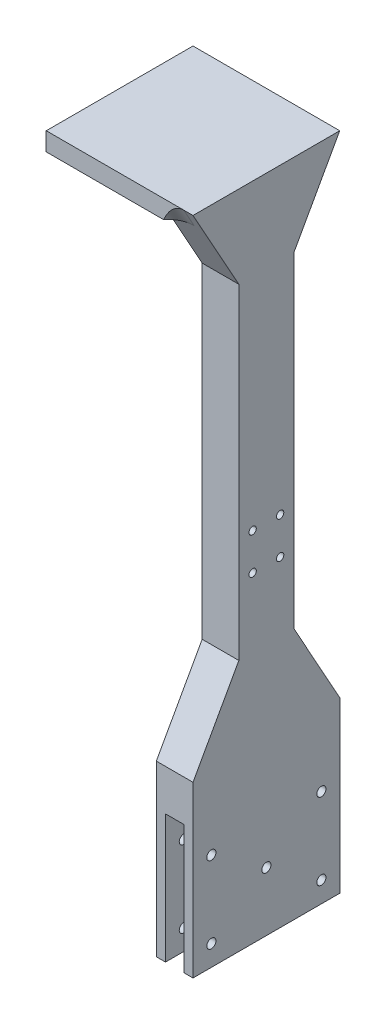
ISO-10303-21;
HEADER;
FILE_DESCRIPTION(('STEP AP214'),'2;1');
FILE_NAME('part.step','',(''),(''),'','','');
FILE_SCHEMA(('AUTOMOTIVE_DESIGN { 1 0 10303 214 1 1 1 1 }'));
ENDSEC;
DATA;
#1=APPLICATION_CONTEXT('core data for automotive mechanical design processes');
#2=APPLICATION_PROTOCOL_DEFINITION('international standard','automotive_design',2000,#1);
#3=PRODUCT_CONTEXT('',#1,'mechanical');
#4=PRODUCT('Part','Part','',(#3));
#5=PRODUCT_RELATED_PRODUCT_CATEGORY('part','',(#4));
#6=PRODUCT_DEFINITION_FORMATION('','',#4);
#7=PRODUCT_DEFINITION_CONTEXT('part definition',#1,'design');
#8=PRODUCT_DEFINITION('design','',#6,#7);
#9=PRODUCT_DEFINITION_SHAPE('','',#8);
#10=(LENGTH_UNIT() NAMED_UNIT(*) SI_UNIT(.MILLI.,.METRE.));
#11=(NAMED_UNIT(*) PLANE_ANGLE_UNIT() SI_UNIT($,.RADIAN.));
#12=(NAMED_UNIT(*) SI_UNIT($,.STERADIAN.) SOLID_ANGLE_UNIT());
#13=UNCERTAINTY_MEASURE_WITH_UNIT(LENGTH_MEASURE(1.E-05),#10,'distance_accuracy_value','');
#14=(GEOMETRIC_REPRESENTATION_CONTEXT(3) GLOBAL_UNCERTAINTY_ASSIGNED_CONTEXT((#13)) GLOBAL_UNIT_ASSIGNED_CONTEXT((#10,
#11,#12)) REPRESENTATION_CONTEXT('',''));
#15=CARTESIAN_POINT('',(0.,0.,0.));
#16=DIRECTION('',(0.,0.,1.));
#17=DIRECTION('',(1.,0.,0.));
#18=AXIS2_PLACEMENT_3D('',#15,#16,#17);
#19=CARTESIAN_POINT('',(0.,0.,80.));
#20=DIRECTION('',(1.,0.,0.));
#21=DIRECTION('',(0.,0.,-1.));
#22=AXIS2_PLACEMENT_3D('',#19,#20,#21);
#23=PLANE('',#22);
#24=CARTESIAN_POINT('',(0.,195.,32.5));
#25=DIRECTION('',(1.,0.,0.));
#26=DIRECTION('',(0.,0.,-1.));
#27=AXIS2_PLACEMENT_3D('',#24,#25,#26);
#28=CIRCLE('',#27,2.);
#29=CARTESIAN_POINT('',(0.,195.,30.5));
#30=VERTEX_POINT('',#29);
#31=EDGE_CURVE('E315',#30,#30,#28,.F.);
#32=ORIENTED_EDGE('',*,*,#31,.F.);
#33=EDGE_LOOP('',(#32));
#34=FACE_BOUND('',#33,.T.);
#35=CARTESIAN_POINT('',(0.,175.,32.5));
#36=DIRECTION('',(1.,0.,0.));
#37=DIRECTION('',(0.,0.,-1.));
#38=AXIS2_PLACEMENT_3D('',#35,#36,#37);
#39=CIRCLE('',#38,2.);
#40=CARTESIAN_POINT('',(0.,175.,30.5));
#41=VERTEX_POINT('',#40);
#42=EDGE_CURVE('E323',#41,#41,#39,.F.);
#43=ORIENTED_EDGE('',*,*,#42,.F.);
#44=EDGE_LOOP('',(#43));
#45=FACE_BOUND('',#44,.T.);
#46=CARTESIAN_POINT('',(0.,175.,47.5));
#47=DIRECTION('',(1.,0.,0.));
#48=DIRECTION('',(0.,0.,-1.));
#49=AXIS2_PLACEMENT_3D('',#46,#47,#48);
#50=CIRCLE('',#49,2.);
#51=CARTESIAN_POINT('',(0.,175.,45.5));
#52=VERTEX_POINT('',#51);
#53=EDGE_CURVE('E316',#52,#52,#50,.F.);
#54=ORIENTED_EDGE('',*,*,#53,.F.);
#55=EDGE_LOOP('',(#54));
#56=FACE_BOUND('',#55,.T.);
#57=CARTESIAN_POINT('',(0.,195.,47.5));
#58=DIRECTION('',(1.,0.,0.));
#59=DIRECTION('',(0.,0.,-1.));
#60=AXIS2_PLACEMENT_3D('',#57,#58,#59);
#61=CIRCLE('',#60,2.);
#62=CARTESIAN_POINT('',(0.,195.,45.5));
#63=VERTEX_POINT('',#62);
#64=EDGE_CURVE('E303',#63,#63,#61,.F.);
#65=ORIENTED_EDGE('',*,*,#64,.F.);
#66=EDGE_LOOP('',(#65));
#67=FACE_BOUND('',#66,.T.);
#68=CARTESIAN_POINT('',(0.,53.0571843789609,70.));
#69=DIRECTION('',(1.,0.,0.));
#70=DIRECTION('',(0.,0.,-1.));
#71=AXIS2_PLACEMENT_3D('',#68,#69,#70);
#72=CIRCLE('',#71,2.5);
#73=CARTESIAN_POINT('',(0.,53.0571843789609,67.5));
#74=VERTEX_POINT('',#73);
#75=EDGE_CURVE('E136',#74,#74,#72,.F.);
#76=ORIENTED_EDGE('',*,*,#75,.F.);
#77=EDGE_LOOP('',(#76));
#78=FACE_BOUND('',#77,.T.);
#79=CARTESIAN_POINT('',(0.,53.0571843789609,10.));
#80=DIRECTION('',(1.,0.,0.));
#81=DIRECTION('',(0.,0.,-1.));
#82=AXIS2_PLACEMENT_3D('',#79,#80,#81);
#83=CIRCLE('',#82,2.5);
#84=CARTESIAN_POINT('',(0.,53.0571843789609,7.5));
#85=VERTEX_POINT('',#84);
#86=EDGE_CURVE('E245',#85,#85,#83,.F.);
#87=ORIENTED_EDGE('',*,*,#86,.F.);
#88=EDGE_LOOP('',(#87));
#89=FACE_BOUND('',#88,.T.);
#90=CARTESIAN_POINT('',(0.,11.2845520257299,10.));
#91=DIRECTION('',(1.,0.,0.));
#92=DIRECTION('',(0.,0.,-1.));
#93=AXIS2_PLACEMENT_3D('',#90,#91,#92);
#94=CIRCLE('',#93,2.5);
#95=CARTESIAN_POINT('',(0.,11.2845520257299,7.5));
#96=VERTEX_POINT('',#95);
#97=EDGE_CURVE('E239',#96,#96,#94,.F.);
#98=ORIENTED_EDGE('',*,*,#97,.F.);
#99=EDGE_LOOP('',(#98));
#100=FACE_BOUND('',#99,.T.);
#101=CARTESIAN_POINT('',(0.,32.1708682023454,40.));
#102=DIRECTION('',(1.,0.,0.));
#103=DIRECTION('',(0.,0.,-1.));
#104=AXIS2_PLACEMENT_3D('',#101,#102,#103);
#105=CIRCLE('',#104,2.5);
#106=CARTESIAN_POINT('',(0.,32.1708682023454,37.5));
#107=VERTEX_POINT('',#106);
#108=EDGE_CURVE('E231',#107,#107,#105,.F.);
#109=ORIENTED_EDGE('',*,*,#108,.F.);
#110=EDGE_LOOP('',(#109));
#111=FACE_BOUND('',#110,.T.);
#112=CARTESIAN_POINT('',(0.,11.2845520257299,70.));
#113=DIRECTION('',(1.,0.,0.));
#114=DIRECTION('',(0.,0.,-1.));
#115=AXIS2_PLACEMENT_3D('',#112,#113,#114);
#116=CIRCLE('',#115,2.5);
#117=CARTESIAN_POINT('',(0.,11.2845520257299,67.5));
#118=VERTEX_POINT('',#117);
#119=EDGE_CURVE('E141',#118,#118,#116,.F.);
#120=ORIENTED_EDGE('',*,*,#119,.F.);
#121=EDGE_LOOP('',(#120));
#122=FACE_BOUND('',#121,.T.);
#123=DIRECTION('',(0.,-0.874157276121537,-0.485642931178633));
#124=VECTOR('',#123,1.);
#125=CARTESIAN_POINT('',(0.,21.7938888742245,-39.2289999736039));
#126=LINE('',#125,#124);
#127=CARTESIAN_POINT('',(0.,137.406088826711,25.));
#128=VERTEX_POINT('',#127);
#129=CARTESIAN_POINT('',(0.,92.4060888267112,0.));
#130=VERTEX_POINT('',#129);
#131=EDGE_CURVE('E280',#128,#130,#126,.T.);
#132=ORIENTED_EDGE('',*,*,#131,.T.);
#133=DIRECTION('',(0.,-1.,0.));
#134=VECTOR('',#133,1.);
#135=CARTESIAN_POINT('',(0.,0.,0.));
#136=LINE('',#135,#134);
#137=CARTESIAN_POINT('',(0.,0.,0.));
#138=VERTEX_POINT('',#137);
#139=EDGE_CURVE('E158',#130,#138,#136,.T.);
#140=ORIENTED_EDGE('',*,*,#139,.T.);
#141=DIRECTION('',(0.,0.,-1.));
#142=VECTOR('',#141,1.);
#143=CARTESIAN_POINT('',(0.,0.,80.));
#144=LINE('',#143,#142);
#145=CARTESIAN_POINT('',(0.,0.,80.));
#146=VERTEX_POINT('',#145);
#147=EDGE_CURVE('E119',#146,#138,#144,.T.);
#148=ORIENTED_EDGE('',*,*,#147,.F.);
#149=DIRECTION('',(0.,-1.,0.));
#150=VECTOR('',#149,1.);
#151=CARTESIAN_POINT('',(0.,0.,80.));
#152=LINE('',#151,#150);
#153=CARTESIAN_POINT('',(0.,92.4060888267109,80.));
#154=VERTEX_POINT('',#153);
#155=EDGE_CURVE('E153',#154,#146,#152,.T.);
#156=ORIENTED_EDGE('',*,*,#155,.F.);
#157=DIRECTION('',(0.,-0.874157276121537,0.485642931178633));
#158=VECTOR('',#157,1.);
#159=CARTESIAN_POINT('',(0.,55.7561530251678,100.361075445302));
#160=LINE('',#159,#158);
#161=CARTESIAN_POINT('',(0.,137.406088826711,55.));
#162=VERTEX_POINT('',#161);
#163=EDGE_CURVE('E258',#162,#154,#160,.T.);
#164=ORIENTED_EDGE('',*,*,#163,.F.);
#165=DIRECTION('',(0.,1.,0.));
#166=VECTOR('',#165,1.);
#167=CARTESIAN_POINT('',(0.,0.,55.));
#168=LINE('',#167,#166);
#169=CARTESIAN_POINT('',(0.,315.,55.));
#170=VERTEX_POINT('',#169);
#171=EDGE_CURVE('E238',#162,#170,#168,.T.);
#172=ORIENTED_EDGE('',*,*,#171,.T.);
#173=DIRECTION('',(0.,0.874157276121538,0.485642931178632));
#174=VECTOR('',#173,1.);
#175=CARTESIAN_POINT('',(0.,50.9433962264152,-91.6981132075472));
#176=LINE('',#175,#174);
#177=CARTESIAN_POINT('',(0.,350.,74.4444444444444));
#178=VERTEX_POINT('',#177);
#179=EDGE_CURVE('E255',#170,#178,#176,.T.);
#180=ORIENTED_EDGE('',*,*,#179,.T.);
#181=DIRECTION('',(0.,0.,-1.));
#182=VECTOR('',#181,1.);
#183=CARTESIAN_POINT('',(0.,350.,80.));
#184=LINE('',#183,#182);
#185=CARTESIAN_POINT('',(0.,350.,5.55555555555556));
#186=VERTEX_POINT('',#185);
#187=EDGE_CURVE('E147',#178,#186,#184,.T.);
#188=ORIENTED_EDGE('',*,*,#187,.T.);
#189=DIRECTION('',(0.,0.874157276121537,-0.485642931178633));
#190=VECTOR('',#189,1.);
#191=CARTESIAN_POINT('',(0.,84.9056603773587,152.830188679245));
#192=LINE('',#191,#190);
#193=CARTESIAN_POINT('',(0.,315.,25.));
#194=VERTEX_POINT('',#193);
#195=EDGE_CURVE('E114',#194,#186,#192,.T.);
#196=ORIENTED_EDGE('',*,*,#195,.F.);
#197=DIRECTION('',(0.,1.,0.));
#198=VECTOR('',#197,1.);
#199=CARTESIAN_POINT('',(0.,0.,25.));
#200=LINE('',#199,#198);
#201=EDGE_CURVE('E306',#128,#194,#200,.T.);
#202=ORIENTED_EDGE('',*,*,#201,.F.);
#203=EDGE_LOOP('',(#132,#140,#148,#156,#164,#172,#180,#188,#196,#202));
#204=FACE_BOUND('',#203,.T.);
#205=ADVANCED_FACE('F33',(#34,#45,#56,#67,#78,#89,#100,#111,#122,#204),#23,.F.);
#206=CARTESIAN_POINT('',(20.,0.,80.));
#207=DIRECTION('',(-1.,0.,0.));
#208=DIRECTION('',(0.,0.,1.));
#209=AXIS2_PLACEMENT_3D('',#206,#207,#208);
#210=PLANE('',#209);
#211=CARTESIAN_POINT('',(20.,195.,32.5));
#212=DIRECTION('',(1.,0.,0.));
#213=DIRECTION('',(0.,0.,1.));
#214=AXIS2_PLACEMENT_3D('',#211,#212,#213);
#215=CIRCLE('',#214,2.);
#216=CARTESIAN_POINT('',(20.,195.,34.5));
#217=VERTEX_POINT('',#216);
#218=EDGE_CURVE('E326',#217,#217,#215,.T.);
#219=ORIENTED_EDGE('',*,*,#218,.F.);
#220=EDGE_LOOP('',(#219));
#221=FACE_BOUND('',#220,.T.);
#222=CARTESIAN_POINT('',(20.,175.,32.5));
#223=DIRECTION('',(1.,0.,0.));
#224=DIRECTION('',(0.,0.,-1.));
#225=AXIS2_PLACEMENT_3D('',#222,#223,#224);
#226=CIRCLE('',#225,2.);
#227=CARTESIAN_POINT('',(20.,175.,30.5));
#228=VERTEX_POINT('',#227);
#229=EDGE_CURVE('E319',#228,#228,#226,.T.);
#230=ORIENTED_EDGE('',*,*,#229,.F.);
#231=EDGE_LOOP('',(#230));
#232=FACE_BOUND('',#231,.T.);
#233=CARTESIAN_POINT('',(20.,175.,47.5));
#234=DIRECTION('',(1.,0.,0.));
#235=DIRECTION('',(0.,0.,1.));
#236=AXIS2_PLACEMENT_3D('',#233,#234,#235);
#237=CIRCLE('',#236,2.);
#238=CARTESIAN_POINT('',(20.,175.,49.5));
#239=VERTEX_POINT('',#238);
#240=EDGE_CURVE('E320',#239,#239,#237,.T.);
#241=ORIENTED_EDGE('',*,*,#240,.F.);
#242=EDGE_LOOP('',(#241));
#243=FACE_BOUND('',#242,.T.);
#244=CARTESIAN_POINT('',(20.,195.,47.5));
#245=DIRECTION('',(1.,0.,0.));
#246=DIRECTION('',(0.,0.,-1.));
#247=AXIS2_PLACEMENT_3D('',#244,#245,#246);
#248=CIRCLE('',#247,2.);
#249=CARTESIAN_POINT('',(20.,195.,45.5));
#250=VERTEX_POINT('',#249);
#251=EDGE_CURVE('E312',#250,#250,#248,.T.);
#252=ORIENTED_EDGE('',*,*,#251,.F.);
#253=EDGE_LOOP('',(#252));
#254=FACE_BOUND('',#253,.T.);
#255=CARTESIAN_POINT('',(20.0000000000001,53.0571843789609,70.));
#256=DIRECTION('',(1.,0.,0.));
#257=DIRECTION('',(0.,1.,0.));
#258=AXIS2_PLACEMENT_3D('',#255,#256,#257);
#259=CIRCLE('',#258,2.5);
#260=CARTESIAN_POINT('',(20.0000000000001,55.5571843789609,70.));
#261=VERTEX_POINT('',#260);
#262=EDGE_CURVE('E248',#261,#261,#259,.T.);
#263=ORIENTED_EDGE('',*,*,#262,.F.);
#264=EDGE_LOOP('',(#263));
#265=FACE_BOUND('',#264,.T.);
#266=CARTESIAN_POINT('',(20.0000000000001,53.0571843789609,10.));
#267=DIRECTION('',(1.,0.,0.));
#268=DIRECTION('',(0.,1.,0.));
#269=AXIS2_PLACEMENT_3D('',#266,#267,#268);
#270=CIRCLE('',#269,2.5);
#271=CARTESIAN_POINT('',(20.0000000000001,55.5571843789609,10.));
#272=VERTEX_POINT('',#271);
#273=EDGE_CURVE('E242',#272,#272,#270,.T.);
#274=ORIENTED_EDGE('',*,*,#273,.F.);
#275=EDGE_LOOP('',(#274));
#276=FACE_BOUND('',#275,.T.);
#277=CARTESIAN_POINT('',(20.0000000000001,11.2845520257299,10.));
#278=DIRECTION('',(1.,0.,0.));
#279=DIRECTION('',(0.,1.,0.));
#280=AXIS2_PLACEMENT_3D('',#277,#278,#279);
#281=CIRCLE('',#280,2.5);
#282=CARTESIAN_POINT('',(20.0000000000001,13.7845520257299,10.));
#283=VERTEX_POINT('',#282);
#284=EDGE_CURVE('E234',#283,#283,#281,.T.);
#285=ORIENTED_EDGE('',*,*,#284,.F.);
#286=EDGE_LOOP('',(#285));
#287=FACE_BOUND('',#286,.T.);
#288=CARTESIAN_POINT('',(20.0000000000001,32.1708682023454,40.));
#289=DIRECTION('',(1.,0.,0.));
#290=DIRECTION('',(0.,1.,0.));
#291=AXIS2_PLACEMENT_3D('',#288,#289,#290);
#292=CIRCLE('',#291,2.5);
#293=CARTESIAN_POINT('',(20.0000000000001,34.6708682023454,40.));
#294=VERTEX_POINT('',#293);
#295=EDGE_CURVE('E235',#294,#294,#292,.T.);
#296=ORIENTED_EDGE('',*,*,#295,.F.);
#297=EDGE_LOOP('',(#296));
#298=FACE_BOUND('',#297,.T.);
#299=CARTESIAN_POINT('',(20.0000000000001,11.2845520257299,70.));
#300=DIRECTION('',(1.,0.,0.));
#301=DIRECTION('',(0.,1.,0.));
#302=AXIS2_PLACEMENT_3D('',#299,#300,#301);
#303=CIRCLE('',#302,2.5);
#304=CARTESIAN_POINT('',(20.0000000000001,13.7845520257299,70.));
#305=VERTEX_POINT('',#304);
#306=EDGE_CURVE('E220',#305,#305,#303,.T.);
#307=ORIENTED_EDGE('',*,*,#306,.F.);
#308=EDGE_LOOP('',(#307));
#309=FACE_BOUND('',#308,.T.);
#310=DIRECTION('',(0.,0.874157276121537,0.485642931178634));
#311=VECTOR('',#310,1.);
#312=CARTESIAN_POINT('',(20.,21.7938888742245,-39.2289999736039));
#313=LINE('',#312,#311);
#314=CARTESIAN_POINT('',(20.,92.4060888267112,0.));
#315=VERTEX_POINT('',#314);
#316=CARTESIAN_POINT('',(20.,137.406088826711,25.));
#317=VERTEX_POINT('',#316);
#318=EDGE_CURVE('E300',#315,#317,#313,.T.);
#319=ORIENTED_EDGE('',*,*,#318,.T.);
#320=DIRECTION('',(0.,-1.,0.));
#321=VECTOR('',#320,1.);
#322=CARTESIAN_POINT('',(20.,0.,25.));
#323=LINE('',#322,#321);
#324=CARTESIAN_POINT('',(20.,315.,25.));
#325=VERTEX_POINT('',#324);
#326=EDGE_CURVE('E289',#325,#317,#323,.T.);
#327=ORIENTED_EDGE('',*,*,#326,.F.);
#328=DIRECTION('',(0.,-0.874157276121537,0.485642931178633));
#329=VECTOR('',#328,1.);
#330=CARTESIAN_POINT('',(20.,84.9056603773587,152.830188679245));
#331=LINE('',#330,#329);
#332=CARTESIAN_POINT('',(20.,360.,0.));
#333=VERTEX_POINT('',#332);
#334=EDGE_CURVE('E297',#333,#325,#331,.T.);
#335=ORIENTED_EDGE('',*,*,#334,.F.);
#336=DIRECTION('',(0.,0.,-1.));
#337=VECTOR('',#336,1.);
#338=CARTESIAN_POINT('',(20.,360.,0.));
#339=LINE('',#338,#337);
#340=CARTESIAN_POINT('',(20.,360.,80.));
#341=VERTEX_POINT('',#340);
#342=EDGE_CURVE('E172',#341,#333,#339,.T.);
#343=ORIENTED_EDGE('',*,*,#342,.F.);
#344=DIRECTION('',(0.,-0.874157276121538,-0.485642931178632));
#345=VECTOR('',#344,1.);
#346=CARTESIAN_POINT('',(20.,50.9433962264152,-91.6981132075472));
#347=LINE('',#346,#345);
#348=CARTESIAN_POINT('',(20.,315.,55.));
#349=VERTEX_POINT('',#348);
#350=EDGE_CURVE('E274',#341,#349,#347,.T.);
#351=ORIENTED_EDGE('',*,*,#350,.T.);
#352=DIRECTION('',(0.,-1.,0.));
#353=VECTOR('',#352,1.);
#354=CARTESIAN_POINT('',(20.,0.,55.));
#355=LINE('',#354,#353);
#356=CARTESIAN_POINT('',(20.,137.406088826711,55.));
#357=VERTEX_POINT('',#356);
#358=EDGE_CURVE('E277',#349,#357,#355,.T.);
#359=ORIENTED_EDGE('',*,*,#358,.T.);
#360=DIRECTION('',(0.,0.874157276121538,-0.485642931178633));
#361=VECTOR('',#360,1.);
#362=CARTESIAN_POINT('',(20.,55.7561530251678,100.361075445302));
#363=LINE('',#362,#361);
#364=CARTESIAN_POINT('',(20.,92.4060888267109,80.));
#365=VERTEX_POINT('',#364);
#366=EDGE_CURVE('E264',#365,#357,#363,.T.);
#367=ORIENTED_EDGE('',*,*,#366,.F.);
#368=DIRECTION('',(0.,1.,0.));
#369=VECTOR('',#368,1.);
#370=CARTESIAN_POINT('',(20.,0.,80.));
#371=LINE('',#370,#369);
#372=CARTESIAN_POINT('',(20.,0.,80.));
#373=VERTEX_POINT('',#372);
#374=EDGE_CURVE('E149',#373,#365,#371,.T.);
#375=ORIENTED_EDGE('',*,*,#374,.F.);
#376=DIRECTION('',(0.,0.,-1.));
#377=VECTOR('',#376,1.);
#378=CARTESIAN_POINT('',(20.,0.,80.));
#379=LINE('',#378,#377);
#380=CARTESIAN_POINT('',(20.,0.,0.));
#381=VERTEX_POINT('',#380);
#382=EDGE_CURVE('E144',#373,#381,#379,.T.);
#383=ORIENTED_EDGE('',*,*,#382,.T.);
#384=DIRECTION('',(0.,1.,0.));
#385=VECTOR('',#384,1.);
#386=CARTESIAN_POINT('',(20.,0.,0.));
#387=LINE('',#386,#385);
#388=EDGE_CURVE('E150',#381,#315,#387,.T.);
#389=ORIENTED_EDGE('',*,*,#388,.T.);
#390=EDGE_LOOP('',(#319,#327,#335,#343,#351,#359,#367,#375,#383,#389));
#391=FACE_BOUND('',#390,.T.);
#392=ADVANCED_FACE('F336',(#221,#232,#243,#254,#265,#276,#287,#298,#309,#391),#210,.F.);
#393=CARTESIAN_POINT('',(0.,0.,0.));
#394=DIRECTION('',(0.,0.,-1.));
#395=DIRECTION('',(-1.,0.,0.));
#396=AXIS2_PLACEMENT_3D('',#393,#394,#395);
#397=PLANE('',#396);
#398=ORIENTED_EDGE('',*,*,#139,.F.);
#399=DIRECTION('',(1.,0.,0.));
#400=VECTOR('',#399,1.);
#401=CARTESIAN_POINT('',(-268.759188302499,92.4060888267112,0.));
#402=LINE('',#401,#400);
#403=EDGE_CURVE('E285',#130,#315,#402,.T.);
#404=ORIENTED_EDGE('',*,*,#403,.T.);
#405=ORIENTED_EDGE('',*,*,#388,.F.);
#406=DIRECTION('',(1.,0.,0.));
#407=VECTOR('',#406,1.);
#408=CARTESIAN_POINT('',(0.,0.,0.));
#409=LINE('',#408,#407);
#410=CARTESIAN_POINT('',(15.,0.,0.));
#411=VERTEX_POINT('',#410);
#412=EDGE_CURVE('E157',#411,#381,#409,.T.);
#413=ORIENTED_EDGE('',*,*,#412,.F.);
#414=DIRECTION('',(0.,1.,0.));
#415=VECTOR('',#414,1.);
#416=CARTESIAN_POINT('',(15.,70.,0.));
#417=LINE('',#416,#415);
#418=CARTESIAN_POINT('',(15.,70.,0.));
#419=VERTEX_POINT('',#418);
#420=EDGE_CURVE('E193',#411,#419,#417,.T.);
#421=ORIENTED_EDGE('',*,*,#420,.T.);
#422=DIRECTION('',(-1.,0.,0.));
#423=VECTOR('',#422,1.);
#424=CARTESIAN_POINT('',(4.99999999999998,70.,0.));
#425=LINE('',#424,#423);
#426=CARTESIAN_POINT('',(4.99999999999998,70.,0.));
#427=VERTEX_POINT('',#426);
#428=EDGE_CURVE('E198',#419,#427,#425,.T.);
#429=ORIENTED_EDGE('',*,*,#428,.T.);
#430=DIRECTION('',(0.,-1.,0.));
#431=VECTOR('',#430,1.);
#432=CARTESIAN_POINT('',(4.99999999999998,70.,0.));
#433=LINE('',#432,#431);
#434=CARTESIAN_POINT('',(5.,0.,0.));
#435=VERTEX_POINT('',#434);
#436=EDGE_CURVE('E189',#427,#435,#433,.T.);
#437=ORIENTED_EDGE('',*,*,#436,.T.);
#438=EDGE_CURVE('E154',#138,#435,#409,.T.);
#439=ORIENTED_EDGE('',*,*,#438,.F.);
#440=EDGE_LOOP('',(#398,#404,#405,#413,#421,#429,#437,#439));
#441=FACE_BOUND('',#440,.T.);
#442=ADVANCED_FACE('F339',(#441),#397,.T.);
#443=DIRECTION('',(-1.,0.,0.));
#444=VECTOR('',#443,1.);
#445=CARTESIAN_POINT('',(-60.,360.,0.));
#446=LINE('',#445,#444);
#447=CARTESIAN_POINT('',(15.,360.,0.));
#448=VERTEX_POINT('',#447);
#449=CARTESIAN_POINT('',(-60.,360.,0.));
#450=VERTEX_POINT('',#449);
#451=EDGE_CURVE('E75',#448,#450,#446,.T.);
#452=ORIENTED_EDGE('',*,*,#451,.F.);
#453=CARTESIAN_POINT('',(15.,329.113109577039,0.));
#454=DIRECTION('',(0.,0.,-1.));
#455=DIRECTION('',(0.,1.,0.));
#456=AXIS2_PLACEMENT_3D('',#453,#454,#455);
#457=ELLIPSE('',#456,30.8868904229609,15.);
#458=CARTESIAN_POINT('',(3.94975232434984,350.,0.));
#459=VERTEX_POINT('',#458);
#460=EDGE_CURVE('E42',#448,#459,#457,.F.);
#461=ORIENTED_EDGE('',*,*,#460,.T.);
#462=DIRECTION('',(-1.,0.,0.));
#463=VECTOR('',#462,1.);
#464=CARTESIAN_POINT('',(-60.,350.,0.));
#465=LINE('',#464,#463);
#466=CARTESIAN_POINT('',(-60.,350.,0.));
#467=VERTEX_POINT('',#466);
#468=EDGE_CURVE('E104',#459,#467,#465,.T.);
#469=ORIENTED_EDGE('',*,*,#468,.T.);
#470=DIRECTION('',(0.,-1.,0.));
#471=VECTOR('',#470,1.);
#472=CARTESIAN_POINT('',(-60.,360.,0.));
#473=LINE('',#472,#471);
#474=EDGE_CURVE('E161',#450,#467,#473,.T.);
#475=ORIENTED_EDGE('',*,*,#474,.F.);
#476=EDGE_LOOP('',(#452,#461,#469,#475));
#477=FACE_BOUND('',#476,.T.);
#478=ADVANCED_FACE('F101',(#477),#397,.T.);
#479=CARTESIAN_POINT('',(0.,0.,80.));
#480=DIRECTION('',(0.,0.,-1.));
#481=DIRECTION('',(-1.,0.,0.));
#482=AXIS2_PLACEMENT_3D('',#479,#480,#481);
#483=PLANE('',#482);
#484=DIRECTION('',(1.,0.,0.));
#485=VECTOR('',#484,1.);
#486=CARTESIAN_POINT('',(20.,350.,80.));
#487=LINE('',#486,#485);
#488=CARTESIAN_POINT('',(-60.,350.,80.));
#489=VERTEX_POINT('',#488);
#490=CARTESIAN_POINT('',(3.94975232434976,350.,80.));
#491=VERTEX_POINT('',#490);
#492=EDGE_CURVE('E64',#489,#491,#487,.T.);
#493=ORIENTED_EDGE('',*,*,#492,.T.);
#494=CARTESIAN_POINT('',(15.,329.113109577039,80.));
#495=DIRECTION('',(0.,0.,-1.));
#496=DIRECTION('',(0.,-1.,0.));
#497=AXIS2_PLACEMENT_3D('',#494,#495,#496);
#498=ELLIPSE('',#497,30.886890422961,15.);
#499=CARTESIAN_POINT('',(15.,360.,80.));
#500=VERTEX_POINT('',#499);
#501=EDGE_CURVE('E69',#491,#500,#498,.T.);
#502=ORIENTED_EDGE('',*,*,#501,.T.);
#503=DIRECTION('',(1.,0.,0.));
#504=VECTOR('',#503,1.);
#505=CARTESIAN_POINT('',(20.,360.,80.));
#506=LINE('',#505,#504);
#507=CARTESIAN_POINT('',(-60.,360.,80.));
#508=VERTEX_POINT('',#507);
#509=EDGE_CURVE('E180',#508,#500,#506,.T.);
#510=ORIENTED_EDGE('',*,*,#509,.F.);
#511=DIRECTION('',(0.,-1.,0.));
#512=VECTOR('',#511,1.);
#513=CARTESIAN_POINT('',(-60.,360.,80.));
#514=LINE('',#513,#512);
#515=EDGE_CURVE('E73',#508,#489,#514,.T.);
#516=ORIENTED_EDGE('',*,*,#515,.T.);
#517=EDGE_LOOP('',(#493,#502,#510,#516));
#518=FACE_BOUND('',#517,.T.);
#519=ADVANCED_FACE('F66',(#518),#483,.F.);
#520=CARTESIAN_POINT('',(0.,0.,80.));
#521=DIRECTION('',(0.,1.,0.));
#522=DIRECTION('',(0.,0.,1.));
#523=AXIS2_PLACEMENT_3D('',#520,#521,#522);
#524=PLANE('',#523);
#525=DIRECTION('',(1.,0.,0.));
#526=VECTOR('',#525,1.);
#527=CARTESIAN_POINT('',(0.,0.,80.));
#528=LINE('',#527,#526);
#529=CARTESIAN_POINT('',(15.,0.,80.));
#530=VERTEX_POINT('',#529);
#531=EDGE_CURVE('E167',#530,#373,#528,.T.);
#532=ORIENTED_EDGE('',*,*,#531,.F.);
#533=DIRECTION('',(0.,0.,1.));
#534=VECTOR('',#533,1.);
#535=CARTESIAN_POINT('',(15.,0.,-70.7106781186548));
#536=LINE('',#535,#534);
#537=EDGE_CURVE('E190',#411,#530,#536,.T.);
#538=ORIENTED_EDGE('',*,*,#537,.F.);
#539=ORIENTED_EDGE('',*,*,#412,.T.);
#540=ORIENTED_EDGE('',*,*,#382,.F.);
#541=EDGE_LOOP('',(#532,#538,#539,#540));
#542=FACE_BOUND('',#541,.T.);
#543=ADVANCED_FACE('F589',(#542),#524,.F.);
#544=ORIENTED_EDGE('',*,*,#438,.T.);
#545=DIRECTION('',(0.,0.,1.));
#546=VECTOR('',#545,1.);
#547=CARTESIAN_POINT('',(5.00000000000001,0.,-70.7106781186548));
#548=LINE('',#547,#546);
#549=CARTESIAN_POINT('',(5.00000000000001,0.,80.));
#550=VERTEX_POINT('',#549);
#551=EDGE_CURVE('E177',#435,#550,#548,.T.);
#552=ORIENTED_EDGE('',*,*,#551,.T.);
#553=EDGE_CURVE('E164',#146,#550,#528,.T.);
#554=ORIENTED_EDGE('',*,*,#553,.F.);
#555=ORIENTED_EDGE('',*,*,#147,.T.);
#556=EDGE_LOOP('',(#544,#552,#554,#555));
#557=FACE_BOUND('',#556,.T.);
#558=ADVANCED_FACE('F488',(#557),#524,.F.);
#559=ORIENTED_EDGE('',*,*,#374,.T.);
#560=DIRECTION('',(1.,0.,0.));
#561=VECTOR('',#560,1.);
#562=CARTESIAN_POINT('',(-268.759188302499,92.4060888267109,80.));
#563=LINE('',#562,#561);
#564=EDGE_CURVE('E267',#154,#365,#563,.T.);
#565=ORIENTED_EDGE('',*,*,#564,.F.);
#566=ORIENTED_EDGE('',*,*,#155,.T.);
#567=ORIENTED_EDGE('',*,*,#553,.T.);
#568=DIRECTION('',(0.,-1.,0.));
#569=VECTOR('',#568,1.);
#570=CARTESIAN_POINT('',(4.99999999999998,70.,80.));
#571=LINE('',#570,#569);
#572=CARTESIAN_POINT('',(4.99999999999998,70.,80.));
#573=VERTEX_POINT('',#572);
#574=EDGE_CURVE('E208',#573,#550,#571,.T.);
#575=ORIENTED_EDGE('',*,*,#574,.F.);
#576=DIRECTION('',(-1.,0.,0.));
#577=VECTOR('',#576,1.);
#578=CARTESIAN_POINT('',(4.99999999999998,70.,80.));
#579=LINE('',#578,#577);
#580=CARTESIAN_POINT('',(15.,70.,80.));
#581=VERTEX_POINT('',#580);
#582=EDGE_CURVE('E194',#581,#573,#579,.T.);
#583=ORIENTED_EDGE('',*,*,#582,.F.);
#584=DIRECTION('',(0.,1.,0.));
#585=VECTOR('',#584,1.);
#586=CARTESIAN_POINT('',(15.,70.,80.));
#587=LINE('',#586,#585);
#588=EDGE_CURVE('E211',#530,#581,#587,.T.);
#589=ORIENTED_EDGE('',*,*,#588,.F.);
#590=ORIENTED_EDGE('',*,*,#531,.T.);
#591=EDGE_LOOP('',(#559,#565,#566,#567,#575,#583,#589,#590));
#592=FACE_BOUND('',#591,.T.);
#593=ADVANCED_FACE('F467',(#592),#483,.F.);
#594=CARTESIAN_POINT('',(0.,350.,0.));
#595=DIRECTION('',(0.,-1.,0.));
#596=DIRECTION('',(0.,0.,-1.));
#597=AXIS2_PLACEMENT_3D('',#594,#595,#596);
#598=PLANE('',#597);
#599=ORIENTED_EDGE('',*,*,#187,.F.);
#600=DIRECTION('',(-1.,0.,0.));
#601=VECTOR('',#600,1.);
#602=CARTESIAN_POINT('',(0.,350.,74.4444444444444));
#603=LINE('',#602,#601);
#604=CARTESIAN_POINT('',(15.,350.,74.4444444444444));
#605=VERTEX_POINT('',#604);
#606=EDGE_CURVE('E84',#605,#178,#603,.T.);
#607=ORIENTED_EDGE('',*,*,#606,.F.);
#608=CARTESIAN_POINT('',(15.,350.,91.603828012756));
#609=DIRECTION('',(0.,-1.,0.));
#610=DIRECTION('',(0.,0.,-1.));
#611=AXIS2_PLACEMENT_3D('',#608,#609,#610);
#612=ELLIPSE('',#611,17.1593835683117,15.);
#613=EDGE_CURVE('E80',#605,#491,#612,.F.);
#614=ORIENTED_EDGE('',*,*,#613,.T.);
#615=ORIENTED_EDGE('',*,*,#492,.F.);
#616=DIRECTION('',(0.,0.,1.));
#617=VECTOR('',#616,1.);
#618=CARTESIAN_POINT('',(-60.,350.,80.));
#619=LINE('',#618,#617);
#620=EDGE_CURVE('E76',#467,#489,#619,.T.);
#621=ORIENTED_EDGE('',*,*,#620,.F.);
#622=ORIENTED_EDGE('',*,*,#468,.F.);
#623=CARTESIAN_POINT('',(15.,350.,-11.6038280127561));
#624=DIRECTION('',(0.,-1.,0.));
#625=DIRECTION('',(0.,0.,-1.));
#626=AXIS2_PLACEMENT_3D('',#623,#624,#625);
#627=ELLIPSE('',#626,17.1593835683117,15.);
#628=CARTESIAN_POINT('',(15.,350.,5.5555555555556));
#629=VERTEX_POINT('',#628);
#630=EDGE_CURVE('E11',#459,#629,#627,.F.);
#631=ORIENTED_EDGE('',*,*,#630,.T.);
#632=DIRECTION('',(1.,0.,0.));
#633=VECTOR('',#632,1.);
#634=CARTESIAN_POINT('',(-268.759188302499,350.,5.55555555555559));
#635=LINE('',#634,#633);
#636=EDGE_CURVE('E49',#186,#629,#635,.T.);
#637=ORIENTED_EDGE('',*,*,#636,.F.);
#638=EDGE_LOOP('',(#599,#607,#614,#615,#621,#622,#631,#637));
#639=FACE_BOUND('',#638,.T.);
#640=ADVANCED_FACE('F81',(#639),#598,.T.);
#641=CARTESIAN_POINT('',(-60.,360.,80.));
#642=DIRECTION('',(1.,0.,0.));
#643=DIRECTION('',(0.,0.,-1.));
#644=AXIS2_PLACEMENT_3D('',#641,#642,#643);
#645=PLANE('',#644);
#646=ORIENTED_EDGE('',*,*,#620,.T.);
#647=ORIENTED_EDGE('',*,*,#515,.F.);
#648=DIRECTION('',(0.,0.,1.));
#649=VECTOR('',#648,1.);
#650=CARTESIAN_POINT('',(-60.,360.,80.));
#651=LINE('',#650,#649);
#652=EDGE_CURVE('E182',#450,#508,#651,.T.);
#653=ORIENTED_EDGE('',*,*,#652,.F.);
#654=ORIENTED_EDGE('',*,*,#474,.T.);
#655=EDGE_LOOP('',(#646,#647,#653,#654));
#656=FACE_BOUND('',#655,.T.);
#657=ADVANCED_FACE('F596',(#656),#645,.F.);
#658=CARTESIAN_POINT('',(0.,360.,0.));
#659=DIRECTION('',(0.,-1.,0.));
#660=DIRECTION('',(0.,0.,-1.));
#661=AXIS2_PLACEMENT_3D('',#658,#659,#660);
#662=PLANE('',#661);
#663=EDGE_CURVE('E185',#333,#448,#446,.T.);
#664=ORIENTED_EDGE('',*,*,#663,.T.);
#665=ORIENTED_EDGE('',*,*,#451,.T.);
#666=ORIENTED_EDGE('',*,*,#652,.T.);
#667=ORIENTED_EDGE('',*,*,#509,.T.);
#668=DIRECTION('',(1.,0.,0.));
#669=VECTOR('',#668,1.);
#670=CARTESIAN_POINT('',(-268.759188302499,360.,80.));
#671=LINE('',#670,#669);
#672=EDGE_CURVE('E263',#500,#341,#671,.T.);
#673=ORIENTED_EDGE('',*,*,#672,.T.);
#674=ORIENTED_EDGE('',*,*,#342,.T.);
#675=EDGE_LOOP('',(#664,#665,#666,#667,#673,#674));
#676=FACE_BOUND('',#675,.T.);
#677=ADVANCED_FACE('F452',(#676),#662,.F.);
#678=CARTESIAN_POINT('',(15.,70.,-70.7106781186548));
#679=DIRECTION('',(1.,0.,0.));
#680=DIRECTION('',(0.,1.,0.));
#681=AXIS2_PLACEMENT_3D('',#678,#679,#680);
#682=PLANE('',#681);
#683=CARTESIAN_POINT('',(15.,53.0571843789609,70.));
#684=DIRECTION('',(1.,0.,0.));
#685=DIRECTION('',(0.,1.,0.));
#686=AXIS2_PLACEMENT_3D('',#683,#684,#685);
#687=CIRCLE('',#686,2.5);
#688=CARTESIAN_POINT('',(15.,55.5571843789609,70.));
#689=VERTEX_POINT('',#688);
#690=EDGE_CURVE('E123',#689,#689,#687,.T.);
#691=ORIENTED_EDGE('',*,*,#690,.T.);
#692=EDGE_LOOP('',(#691));
#693=FACE_BOUND('',#692,.T.);
#694=CARTESIAN_POINT('',(15.,53.0571843789609,10.));
#695=DIRECTION('',(1.,0.,0.));
#696=DIRECTION('',(0.,1.,0.));
#697=AXIS2_PLACEMENT_3D('',#694,#695,#696);
#698=CIRCLE('',#697,2.5);
#699=CARTESIAN_POINT('',(15.,55.5571843789609,10.));
#700=VERTEX_POINT('',#699);
#701=EDGE_CURVE('E124',#700,#700,#698,.T.);
#702=ORIENTED_EDGE('',*,*,#701,.T.);
#703=EDGE_LOOP('',(#702));
#704=FACE_BOUND('',#703,.T.);
#705=CARTESIAN_POINT('',(15.,11.2845520257299,10.));
#706=DIRECTION('',(1.,0.,0.));
#707=DIRECTION('',(0.,1.,0.));
#708=AXIS2_PLACEMENT_3D('',#705,#706,#707);
#709=CIRCLE('',#708,2.5);
#710=CARTESIAN_POINT('',(15.,13.7845520257299,10.));
#711=VERTEX_POINT('',#710);
#712=EDGE_CURVE('E128',#711,#711,#709,.T.);
#713=ORIENTED_EDGE('',*,*,#712,.T.);
#714=EDGE_LOOP('',(#713));
#715=FACE_BOUND('',#714,.T.);
#716=CARTESIAN_POINT('',(15.,32.1708682023454,40.));
#717=DIRECTION('',(1.,0.,0.));
#718=DIRECTION('',(0.,1.,0.));
#719=AXIS2_PLACEMENT_3D('',#716,#717,#718);
#720=CIRCLE('',#719,2.5);
#721=CARTESIAN_POINT('',(15.,34.6708682023454,40.));
#722=VERTEX_POINT('',#721);
#723=EDGE_CURVE('E132',#722,#722,#720,.T.);
#724=ORIENTED_EDGE('',*,*,#723,.T.);
#725=EDGE_LOOP('',(#724));
#726=FACE_BOUND('',#725,.T.);
#727=CARTESIAN_POINT('',(15.,11.2845520257299,70.));
#728=DIRECTION('',(1.,0.,0.));
#729=DIRECTION('',(0.,1.,0.));
#730=AXIS2_PLACEMENT_3D('',#727,#728,#729);
#731=CIRCLE('',#730,2.5);
#732=CARTESIAN_POINT('',(15.,13.7845520257299,70.));
#733=VERTEX_POINT('',#732);
#734=EDGE_CURVE('E140',#733,#733,#731,.T.);
#735=ORIENTED_EDGE('',*,*,#734,.T.);
#736=EDGE_LOOP('',(#735));
#737=FACE_BOUND('',#736,.T.);
#738=ORIENTED_EDGE('',*,*,#537,.T.);
#739=ORIENTED_EDGE('',*,*,#588,.T.);
#740=DIRECTION('',(0.,0.,1.));
#741=VECTOR('',#740,1.);
#742=CARTESIAN_POINT('',(15.,70.,-70.7106781186548));
#743=LINE('',#742,#741);
#744=EDGE_CURVE('E195',#419,#581,#743,.T.);
#745=ORIENTED_EDGE('',*,*,#744,.F.);
#746=ORIENTED_EDGE('',*,*,#420,.F.);
#747=EDGE_LOOP('',(#738,#739,#745,#746));
#748=FACE_BOUND('',#747,.T.);
#749=ADVANCED_FACE('F604',(#693,#704,#715,#726,#737,#748),#682,.F.);
#750=CARTESIAN_POINT('',(4.99999999999998,70.,-70.7106781186548));
#751=DIRECTION('',(0.,1.,0.));
#752=DIRECTION('',(-1.,0.,0.));
#753=AXIS2_PLACEMENT_3D('',#750,#751,#752);
#754=PLANE('',#753);
#755=ORIENTED_EDGE('',*,*,#744,.T.);
#756=ORIENTED_EDGE('',*,*,#582,.T.);
#757=DIRECTION('',(0.,0.,1.));
#758=VECTOR('',#757,1.);
#759=CARTESIAN_POINT('',(4.99999999999998,70.,-70.7106781186548));
#760=LINE('',#759,#758);
#761=EDGE_CURVE('E199',#427,#573,#760,.T.);
#762=ORIENTED_EDGE('',*,*,#761,.F.);
#763=ORIENTED_EDGE('',*,*,#428,.F.);
#764=EDGE_LOOP('',(#755,#756,#762,#763));
#765=FACE_BOUND('',#764,.T.);
#766=ADVANCED_FACE('F618',(#765),#754,.F.);
#767=CARTESIAN_POINT('',(4.99999999999998,70.,-70.7106781186548));
#768=DIRECTION('',(-1.,0.,0.));
#769=DIRECTION('',(0.,-1.,0.));
#770=AXIS2_PLACEMENT_3D('',#767,#768,#769);
#771=PLANE('',#770);
#772=CARTESIAN_POINT('',(4.99999999999999,53.0571843789609,70.));
#773=DIRECTION('',(-1.,0.,0.));
#774=DIRECTION('',(0.,-1.,0.));
#775=AXIS2_PLACEMENT_3D('',#772,#773,#774);
#776=CIRCLE('',#775,2.5);
#777=CARTESIAN_POINT('',(4.99999999999999,50.5571843789609,70.));
#778=VERTEX_POINT('',#777);
#779=EDGE_CURVE('E120',#778,#778,#776,.T.);
#780=ORIENTED_EDGE('',*,*,#779,.T.);
#781=EDGE_LOOP('',(#780));
#782=FACE_BOUND('',#781,.T.);
#783=CARTESIAN_POINT('',(4.99999999999999,53.0571843789609,10.));
#784=DIRECTION('',(-1.,0.,0.));
#785=DIRECTION('',(0.,-1.,0.));
#786=AXIS2_PLACEMENT_3D('',#783,#784,#785);
#787=CIRCLE('',#786,2.5);
#788=CARTESIAN_POINT('',(4.99999999999999,50.5571843789609,10.));
#789=VERTEX_POINT('',#788);
#790=EDGE_CURVE('E125',#789,#789,#787,.T.);
#791=ORIENTED_EDGE('',*,*,#790,.T.);
#792=EDGE_LOOP('',(#791));
#793=FACE_BOUND('',#792,.T.);
#794=CARTESIAN_POINT('',(5.00000000000001,11.2845520257299,10.));
#795=DIRECTION('',(-1.,0.,0.));
#796=DIRECTION('',(0.,-1.,0.));
#797=AXIS2_PLACEMENT_3D('',#794,#795,#796);
#798=CIRCLE('',#797,2.5);
#799=CARTESIAN_POINT('',(5.00000000000001,8.78455202572987,10.));
#800=VERTEX_POINT('',#799);
#801=EDGE_CURVE('E129',#800,#800,#798,.T.);
#802=ORIENTED_EDGE('',*,*,#801,.T.);
#803=EDGE_LOOP('',(#802));
#804=FACE_BOUND('',#803,.T.);
#805=CARTESIAN_POINT('',(5.,32.1708682023454,40.));
#806=DIRECTION('',(-1.,0.,0.));
#807=DIRECTION('',(0.,-1.,0.));
#808=AXIS2_PLACEMENT_3D('',#805,#806,#807);
#809=CIRCLE('',#808,2.5);
#810=CARTESIAN_POINT('',(5.,29.6708682023454,40.));
#811=VERTEX_POINT('',#810);
#812=EDGE_CURVE('E133',#811,#811,#809,.T.);
#813=ORIENTED_EDGE('',*,*,#812,.T.);
#814=EDGE_LOOP('',(#813));
#815=FACE_BOUND('',#814,.T.);
#816=CARTESIAN_POINT('',(5.00000000000001,11.2845520257299,70.));
#817=DIRECTION('',(-1.,0.,0.));
#818=DIRECTION('',(0.,-1.,0.));
#819=AXIS2_PLACEMENT_3D('',#816,#817,#818);
#820=CIRCLE('',#819,2.5);
#821=CARTESIAN_POINT('',(5.00000000000001,8.78455202572987,70.));
#822=VERTEX_POINT('',#821);
#823=EDGE_CURVE('E137',#822,#822,#820,.T.);
#824=ORIENTED_EDGE('',*,*,#823,.T.);
#825=EDGE_LOOP('',(#824));
#826=FACE_BOUND('',#825,.T.);
#827=ORIENTED_EDGE('',*,*,#761,.T.);
#828=ORIENTED_EDGE('',*,*,#574,.T.);
#829=ORIENTED_EDGE('',*,*,#551,.F.);
#830=ORIENTED_EDGE('',*,*,#436,.F.);
#831=EDGE_LOOP('',(#827,#828,#829,#830));
#832=FACE_BOUND('',#831,.T.);
#833=ADVANCED_FACE('F627',(#782,#793,#804,#815,#826,#832),#771,.F.);
#834=CARTESIAN_POINT('',(-7.07106781186548,11.2845520257299,70.));
#835=DIRECTION('',(1.,0.,0.));
#836=DIRECTION('',(0.,1.,0.));
#837=AXIS2_PLACEMENT_3D('',#834,#835,#836);
#838=CYLINDRICAL_SURFACE('',#837,2.5);
#839=ORIENTED_EDGE('',*,*,#119,.T.);
#840=EDGE_LOOP('',(#839));
#841=FACE_BOUND('',#840,.T.);
#842=ORIENTED_EDGE('',*,*,#823,.F.);
#843=EDGE_LOOP('',(#842));
#844=FACE_BOUND('',#843,.T.);
#845=ADVANCED_FACE('F635',(#841,#844),#838,.F.);
#846=ORIENTED_EDGE('',*,*,#306,.T.);
#847=EDGE_LOOP('',(#846));
#848=FACE_BOUND('',#847,.T.);
#849=ORIENTED_EDGE('',*,*,#734,.F.);
#850=EDGE_LOOP('',(#849));
#851=FACE_BOUND('',#850,.T.);
#852=ADVANCED_FACE('F643',(#848,#851),#838,.F.);
#853=CARTESIAN_POINT('',(-7.07106781186548,32.1708682023454,40.));
#854=DIRECTION('',(1.,0.,0.));
#855=DIRECTION('',(0.,1.,0.));
#856=AXIS2_PLACEMENT_3D('',#853,#854,#855);
#857=CYLINDRICAL_SURFACE('',#856,2.5);
#858=ORIENTED_EDGE('',*,*,#108,.T.);
#859=EDGE_LOOP('',(#858));
#860=FACE_BOUND('',#859,.T.);
#861=ORIENTED_EDGE('',*,*,#812,.F.);
#862=EDGE_LOOP('',(#861));
#863=FACE_BOUND('',#862,.T.);
#864=ADVANCED_FACE('F651',(#860,#863),#857,.F.);
#865=CARTESIAN_POINT('',(-7.07106781186548,11.2845520257299,10.));
#866=DIRECTION('',(1.,0.,0.));
#867=DIRECTION('',(0.,1.,0.));
#868=AXIS2_PLACEMENT_3D('',#865,#866,#867);
#869=CYLINDRICAL_SURFACE('',#868,2.5);
#870=ORIENTED_EDGE('',*,*,#97,.T.);
#871=EDGE_LOOP('',(#870));
#872=FACE_BOUND('',#871,.T.);
#873=ORIENTED_EDGE('',*,*,#801,.F.);
#874=EDGE_LOOP('',(#873));
#875=FACE_BOUND('',#874,.T.);
#876=ADVANCED_FACE('F658',(#872,#875),#869,.F.);
#877=CARTESIAN_POINT('',(-7.07106781186549,53.0571843789609,10.));
#878=DIRECTION('',(1.,0.,0.));
#879=DIRECTION('',(0.,1.,0.));
#880=AXIS2_PLACEMENT_3D('',#877,#878,#879);
#881=CYLINDRICAL_SURFACE('',#880,2.5);
#882=ORIENTED_EDGE('',*,*,#86,.T.);
#883=EDGE_LOOP('',(#882));
#884=FACE_BOUND('',#883,.T.);
#885=ORIENTED_EDGE('',*,*,#790,.F.);
#886=EDGE_LOOP('',(#885));
#887=FACE_BOUND('',#886,.T.);
#888=ADVANCED_FACE('F667',(#884,#887),#881,.F.);
#889=CARTESIAN_POINT('',(-7.07106781186549,53.0571843789609,70.));
#890=DIRECTION('',(1.,0.,0.));
#891=DIRECTION('',(0.,1.,0.));
#892=AXIS2_PLACEMENT_3D('',#889,#890,#891);
#893=CYLINDRICAL_SURFACE('',#892,2.5);
#894=ORIENTED_EDGE('',*,*,#75,.T.);
#895=EDGE_LOOP('',(#894));
#896=FACE_BOUND('',#895,.T.);
#897=ORIENTED_EDGE('',*,*,#779,.F.);
#898=EDGE_LOOP('',(#897));
#899=FACE_BOUND('',#898,.T.);
#900=ADVANCED_FACE('F676',(#896,#899),#893,.F.);
#901=ORIENTED_EDGE('',*,*,#295,.T.);
#902=EDGE_LOOP('',(#901));
#903=FACE_BOUND('',#902,.T.);
#904=ORIENTED_EDGE('',*,*,#723,.F.);
#905=EDGE_LOOP('',(#904));
#906=FACE_BOUND('',#905,.T.);
#907=ADVANCED_FACE('F661',(#903,#906),#857,.F.);
#908=ORIENTED_EDGE('',*,*,#284,.T.);
#909=EDGE_LOOP('',(#908));
#910=FACE_BOUND('',#909,.T.);
#911=ORIENTED_EDGE('',*,*,#712,.F.);
#912=EDGE_LOOP('',(#911));
#913=FACE_BOUND('',#912,.T.);
#914=ADVANCED_FACE('F670',(#910,#913),#869,.F.);
#915=ORIENTED_EDGE('',*,*,#273,.T.);
#916=EDGE_LOOP('',(#915));
#917=FACE_BOUND('',#916,.T.);
#918=ORIENTED_EDGE('',*,*,#701,.F.);
#919=EDGE_LOOP('',(#918));
#920=FACE_BOUND('',#919,.T.);
#921=ADVANCED_FACE('F679',(#917,#920),#881,.F.);
#922=ORIENTED_EDGE('',*,*,#262,.T.);
#923=EDGE_LOOP('',(#922));
#924=FACE_BOUND('',#923,.T.);
#925=ORIENTED_EDGE('',*,*,#690,.F.);
#926=EDGE_LOOP('',(#925));
#927=FACE_BOUND('',#926,.T.);
#928=ADVANCED_FACE('F550',(#924,#927),#893,.F.);
#929=CARTESIAN_POINT('',(-268.759188302499,50.9433962264152,-91.6981132075472));
#930=DIRECTION('',(0.,-0.485642931178632,0.874157276121538));
#931=DIRECTION('',(0.,-0.874157276121538,-0.485642931178632));
#932=AXIS2_PLACEMENT_3D('',#929,#930,#931);
#933=PLANE('',#932);
#934=ORIENTED_EDGE('',*,*,#672,.F.);
#935=DIRECTION('',(0.,0.874157276121538,0.485642931178632));
#936=VECTOR('',#935,1.);
#937=CARTESIAN_POINT('',(15.,350.,74.4444444444444));
#938=LINE('',#937,#936);
#939=EDGE_CURVE('E89',#500,#605,#938,.F.);
#940=ORIENTED_EDGE('',*,*,#939,.T.);
#941=ORIENTED_EDGE('',*,*,#606,.T.);
#942=ORIENTED_EDGE('',*,*,#179,.F.);
#943=DIRECTION('',(1.,0.,0.));
#944=VECTOR('',#943,1.);
#945=CARTESIAN_POINT('',(-268.759188302499,315.,55.));
#946=LINE('',#945,#944);
#947=EDGE_CURVE('E260',#170,#349,#946,.T.);
#948=ORIENTED_EDGE('',*,*,#947,.T.);
#949=ORIENTED_EDGE('',*,*,#350,.F.);
#950=EDGE_LOOP('',(#934,#940,#941,#942,#948,#949));
#951=FACE_BOUND('',#950,.T.);
#952=ADVANCED_FACE('F456',(#951),#933,.T.);
#953=CARTESIAN_POINT('',(-268.759188302499,55.7561530251678,100.361075445302));
#954=DIRECTION('',(0.,-0.485642931178633,-0.874157276121537));
#955=DIRECTION('',(0.,0.874157276121537,-0.485642931178633));
#956=AXIS2_PLACEMENT_3D('',#953,#954,#955);
#957=PLANE('',#956);
#958=ORIENTED_EDGE('',*,*,#163,.T.);
#959=ORIENTED_EDGE('',*,*,#564,.T.);
#960=ORIENTED_EDGE('',*,*,#366,.T.);
#961=DIRECTION('',(1.,0.,0.));
#962=VECTOR('',#961,1.);
#963=CARTESIAN_POINT('',(-268.759188302499,137.406088826711,55.));
#964=LINE('',#963,#962);
#965=EDGE_CURVE('E259',#162,#357,#964,.T.);
#966=ORIENTED_EDGE('',*,*,#965,.F.);
#967=EDGE_LOOP('',(#958,#959,#960,#966));
#968=FACE_BOUND('',#967,.T.);
#969=ADVANCED_FACE('F466',(#968),#957,.F.);
#970=CARTESIAN_POINT('',(-268.759188302499,0.,55.));
#971=DIRECTION('',(0.,0.,1.));
#972=DIRECTION('',(0.,-1.,0.));
#973=AXIS2_PLACEMENT_3D('',#970,#971,#972);
#974=PLANE('',#973);
#975=ORIENTED_EDGE('',*,*,#965,.T.);
#976=ORIENTED_EDGE('',*,*,#358,.F.);
#977=ORIENTED_EDGE('',*,*,#947,.F.);
#978=ORIENTED_EDGE('',*,*,#171,.F.);
#979=EDGE_LOOP('',(#975,#976,#977,#978));
#980=FACE_BOUND('',#979,.T.);
#981=ADVANCED_FACE('F462',(#980),#974,.T.);
#982=CARTESIAN_POINT('',(-268.759188302499,21.7938888742245,-39.2289999736039));
#983=DIRECTION('',(0.,0.485642931178634,-0.874157276121537));
#984=DIRECTION('',(0.,0.874157276121537,0.485642931178633));
#985=AXIS2_PLACEMENT_3D('',#982,#983,#984);
#986=PLANE('',#985);
#987=DIRECTION('',(1.,0.,0.));
#988=VECTOR('',#987,1.);
#989=CARTESIAN_POINT('',(-268.759188302499,137.406088826711,25.));
#990=LINE('',#989,#988);
#991=EDGE_CURVE('E292',#128,#317,#990,.T.);
#992=ORIENTED_EDGE('',*,*,#991,.T.);
#993=ORIENTED_EDGE('',*,*,#318,.F.);
#994=ORIENTED_EDGE('',*,*,#403,.F.);
#995=ORIENTED_EDGE('',*,*,#131,.F.);
#996=EDGE_LOOP('',(#992,#993,#994,#995));
#997=FACE_BOUND('',#996,.T.);
#998=ADVANCED_FACE('F368',(#997),#986,.T.);
#999=CARTESIAN_POINT('',(-268.759188302499,0.,25.));
#1000=DIRECTION('',(0.,0.,1.));
#1001=DIRECTION('',(0.,-1.,0.));
#1002=AXIS2_PLACEMENT_3D('',#999,#1000,#1001);
#1003=PLANE('',#1002);
#1004=ORIENTED_EDGE('',*,*,#201,.T.);
#1005=DIRECTION('',(1.,0.,0.));
#1006=VECTOR('',#1005,1.);
#1007=CARTESIAN_POINT('',(-268.759188302499,315.,25.));
#1008=LINE('',#1007,#1006);
#1009=EDGE_CURVE('E288',#194,#325,#1008,.T.);
#1010=ORIENTED_EDGE('',*,*,#1009,.T.);
#1011=ORIENTED_EDGE('',*,*,#326,.T.);
#1012=ORIENTED_EDGE('',*,*,#991,.F.);
#1013=EDGE_LOOP('',(#1004,#1010,#1011,#1012));
#1014=FACE_BOUND('',#1013,.T.);
#1015=ADVANCED_FACE('F469',(#1014),#1003,.F.);
#1016=CARTESIAN_POINT('',(-268.759188302499,84.9056603773587,152.830188679245));
#1017=DIRECTION('',(0.,0.485642931178633,0.874157276121537));
#1018=DIRECTION('',(0.,-0.874157276121537,0.485642931178633));
#1019=AXIS2_PLACEMENT_3D('',#1016,#1017,#1018);
#1020=PLANE('',#1019);
#1021=ORIENTED_EDGE('',*,*,#636,.T.);
#1022=DIRECTION('',(0.,0.874157276121537,-0.485642931178633));
#1023=VECTOR('',#1022,1.);
#1024=CARTESIAN_POINT('',(15.,84.9056603773587,152.830188679245));
#1025=LINE('',#1024,#1023);
#1026=EDGE_CURVE('E90',#629,#448,#1025,.T.);
#1027=ORIENTED_EDGE('',*,*,#1026,.T.);
#1028=ORIENTED_EDGE('',*,*,#663,.F.);
#1029=ORIENTED_EDGE('',*,*,#334,.T.);
#1030=ORIENTED_EDGE('',*,*,#1009,.F.);
#1031=ORIENTED_EDGE('',*,*,#195,.T.);
#1032=EDGE_LOOP('',(#1021,#1027,#1028,#1029,#1030,#1031));
#1033=FACE_BOUND('',#1032,.T.);
#1034=ADVANCED_FACE('F109',(#1033),#1020,.F.);
#1035=CARTESIAN_POINT('',(15.,77.6210164096791,-59.7178295374223));
#1036=DIRECTION('',(0.,-0.874157276121538,-0.485642931178632));
#1037=DIRECTION('',(0.,0.485642931178632,-0.874157276121538));
#1038=AXIS2_PLACEMENT_3D('',#1035,#1036,#1037);
#1039=CYLINDRICAL_SURFACE('',#1038,15.);
#1040=ORIENTED_EDGE('',*,*,#613,.F.);
#1041=ORIENTED_EDGE('',*,*,#939,.F.);
#1042=ORIENTED_EDGE('',*,*,#501,.F.);
#1043=EDGE_LOOP('',(#1040,#1041,#1042));
#1044=FACE_BOUND('',#1043,.T.);
#1045=ADVANCED_FACE('F88',(#1044),#1039,.F.);
#1046=CARTESIAN_POINT('',(15.,77.6210164096793,139.717829537422));
#1047=DIRECTION('',(0.,0.874157276121537,-0.485642931178633));
#1048=DIRECTION('',(0.,0.485642931178633,0.874157276121537));
#1049=AXIS2_PLACEMENT_3D('',#1046,#1047,#1048);
#1050=CYLINDRICAL_SURFACE('',#1049,15.);
#1051=ORIENTED_EDGE('',*,*,#630,.F.);
#1052=ORIENTED_EDGE('',*,*,#460,.F.);
#1053=ORIENTED_EDGE('',*,*,#1026,.F.);
#1054=EDGE_LOOP('',(#1051,#1052,#1053));
#1055=FACE_BOUND('',#1054,.T.);
#1056=ADVANCED_FACE('F35',(#1055),#1050,.F.);
#1057=CARTESIAN_POINT('',(-5.65685424949239,195.,47.5));
#1058=DIRECTION('',(1.,0.,0.));
#1059=DIRECTION('',(0.,0.,-1.));
#1060=AXIS2_PLACEMENT_3D('',#1057,#1058,#1059);
#1061=CYLINDRICAL_SURFACE('',#1060,2.);
#1062=ORIENTED_EDGE('',*,*,#64,.T.);
#1063=EDGE_LOOP('',(#1062));
#1064=FACE_BOUND('',#1063,.T.);
#1065=ORIENTED_EDGE('',*,*,#251,.T.);
#1066=EDGE_LOOP('',(#1065));
#1067=FACE_BOUND('',#1066,.T.);
#1068=ADVANCED_FACE('F493',(#1064,#1067),#1061,.F.);
#1069=CARTESIAN_POINT('',(-5.65685424949239,175.,47.5));
#1070=DIRECTION('',(1.,0.,0.));
#1071=DIRECTION('',(0.,0.,-1.));
#1072=AXIS2_PLACEMENT_3D('',#1069,#1070,#1071);
#1073=CYLINDRICAL_SURFACE('',#1072,2.);
#1074=ORIENTED_EDGE('',*,*,#53,.T.);
#1075=EDGE_LOOP('',(#1074));
#1076=FACE_BOUND('',#1075,.T.);
#1077=ORIENTED_EDGE('',*,*,#240,.T.);
#1078=EDGE_LOOP('',(#1077));
#1079=FACE_BOUND('',#1078,.T.);
#1080=ADVANCED_FACE('F496',(#1076,#1079),#1073,.F.);
#1081=CARTESIAN_POINT('',(-5.65685424949239,175.,32.5));
#1082=DIRECTION('',(1.,0.,0.));
#1083=DIRECTION('',(0.,0.,-1.));
#1084=AXIS2_PLACEMENT_3D('',#1081,#1082,#1083);
#1085=CYLINDRICAL_SURFACE('',#1084,2.);
#1086=ORIENTED_EDGE('',*,*,#42,.T.);
#1087=EDGE_LOOP('',(#1086));
#1088=FACE_BOUND('',#1087,.T.);
#1089=ORIENTED_EDGE('',*,*,#229,.T.);
#1090=EDGE_LOOP('',(#1089));
#1091=FACE_BOUND('',#1090,.T.);
#1092=ADVANCED_FACE('F501',(#1088,#1091),#1085,.F.);
#1093=CARTESIAN_POINT('',(-5.65685424949239,195.,32.5));
#1094=DIRECTION('',(1.,0.,0.));
#1095=DIRECTION('',(0.,0.,-1.));
#1096=AXIS2_PLACEMENT_3D('',#1093,#1094,#1095);
#1097=CYLINDRICAL_SURFACE('',#1096,2.);
#1098=ORIENTED_EDGE('',*,*,#31,.T.);
#1099=EDGE_LOOP('',(#1098));
#1100=FACE_BOUND('',#1099,.T.);
#1101=ORIENTED_EDGE('',*,*,#218,.T.);
#1102=EDGE_LOOP('',(#1101));
#1103=FACE_BOUND('',#1102,.T.);
#1104=ADVANCED_FACE('F334',(#1100,#1103),#1097,.F.);
#1105=CLOSED_SHELL('',(#205,#392,#442,#478,#519,#543,#558,#593,#640,#657,#677,#749,#766,#833,
#845,#852,#864,#876,#888,#900,#907,#914,#921,#928,#952,#969,#981,#998,#1015,#1034,#1045,#1056,
#1068,#1080,#1092,#1104));
#1106=MANIFOLD_SOLID_BREP('B2',#1105);
#1107=ADVANCED_BREP_SHAPE_REPRESENTATION('',(#18,#1106),#14);
#1108=SHAPE_DEFINITION_REPRESENTATION(#9,#1107);
ENDSEC;
END-ISO-10303-21;
